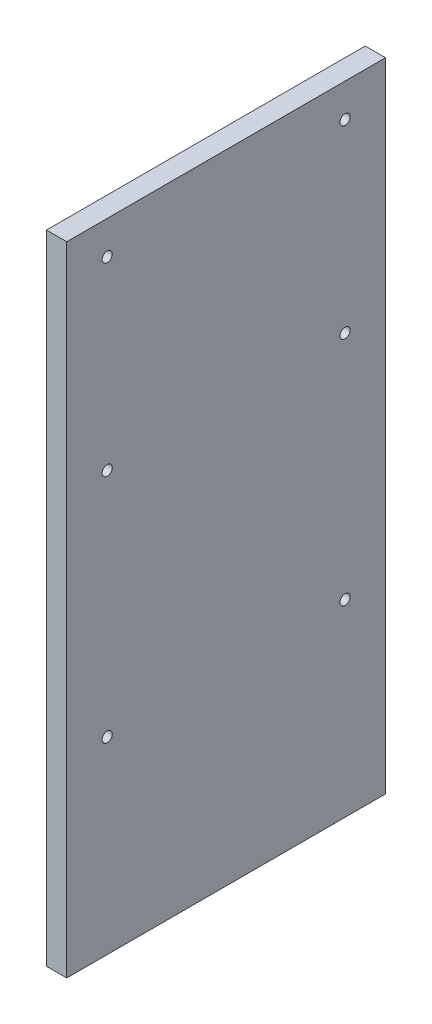
ISO-10303-21;
HEADER;
FILE_DESCRIPTION(('STEP AP214'),'2;1');
FILE_NAME('part.step','',(''),(''),'','','');
FILE_SCHEMA(('AUTOMOTIVE_DESIGN { 1 0 10303 214 1 1 1 1 }'));
ENDSEC;
DATA;
#1=APPLICATION_CONTEXT('core data for automotive mechanical design processes');
#2=APPLICATION_PROTOCOL_DEFINITION('international standard','automotive_design',2000,#1);
#3=PRODUCT_CONTEXT('',#1,'mechanical');
#4=PRODUCT('Part','Part','',(#3));
#5=PRODUCT_RELATED_PRODUCT_CATEGORY('part','',(#4));
#6=PRODUCT_DEFINITION_FORMATION('','',#4);
#7=PRODUCT_DEFINITION_CONTEXT('part definition',#1,'design');
#8=PRODUCT_DEFINITION('design','',#6,#7);
#9=PRODUCT_DEFINITION_SHAPE('','',#8);
#10=(LENGTH_UNIT() NAMED_UNIT(*) SI_UNIT(.MILLI.,.METRE.));
#11=(NAMED_UNIT(*) PLANE_ANGLE_UNIT() SI_UNIT($,.RADIAN.));
#12=(NAMED_UNIT(*) SI_UNIT($,.STERADIAN.) SOLID_ANGLE_UNIT());
#13=UNCERTAINTY_MEASURE_WITH_UNIT(LENGTH_MEASURE(1.E-05),#10,'distance_accuracy_value','');
#14=(GEOMETRIC_REPRESENTATION_CONTEXT(3) GLOBAL_UNCERTAINTY_ASSIGNED_CONTEXT((#13)) GLOBAL_UNIT_ASSIGNED_CONTEXT((#10,
#11,#12)) REPRESENTATION_CONTEXT('',''));
#15=CARTESIAN_POINT('',(0.,0.,0.));
#16=DIRECTION('',(0.,0.,1.));
#17=DIRECTION('',(1.,0.,0.));
#18=AXIS2_PLACEMENT_3D('',#15,#16,#17);
#19=CARTESIAN_POINT('',(6.35,0.,0.));
#20=DIRECTION('',(0.,0.,-1.));
#21=DIRECTION('',(0.,1.,0.));
#22=AXIS2_PLACEMENT_3D('',#19,#20,#21);
#23=PLANE('',#22);
#24=DIRECTION('',(0.,-1.,0.));
#25=VECTOR('',#24,1.);
#26=CARTESIAN_POINT('',(0.,0.,0.));
#27=LINE('',#26,#25);
#28=CARTESIAN_POINT('',(0.,0.,0.));
#29=VERTEX_POINT('',#28);
#30=CARTESIAN_POINT('',(0.,-200.,0.));
#31=VERTEX_POINT('',#30);
#32=EDGE_CURVE('E100',#29,#31,#27,.T.);
#33=ORIENTED_EDGE('',*,*,#32,.T.);
#34=DIRECTION('',(-1.,0.,0.));
#35=VECTOR('',#34,1.);
#36=CARTESIAN_POINT('',(6.35,-200.,0.));
#37=LINE('',#36,#35);
#38=CARTESIAN_POINT('',(6.35,-200.,0.));
#39=VERTEX_POINT('',#38);
#40=EDGE_CURVE('E11',#39,#31,#37,.T.);
#41=ORIENTED_EDGE('',*,*,#40,.F.);
#42=DIRECTION('',(0.,-1.,0.));
#43=VECTOR('',#42,1.);
#44=CARTESIAN_POINT('',(6.35,0.,0.));
#45=LINE('',#44,#43);
#46=CARTESIAN_POINT('',(6.35,0.,0.));
#47=VERTEX_POINT('',#46);
#48=EDGE_CURVE('E87',#47,#39,#45,.T.);
#49=ORIENTED_EDGE('',*,*,#48,.F.);
#50=DIRECTION('',(-1.,0.,0.));
#51=VECTOR('',#50,1.);
#52=CARTESIAN_POINT('',(6.35,0.,0.));
#53=LINE('',#52,#51);
#54=EDGE_CURVE('E96',#47,#29,#53,.T.);
#55=ORIENTED_EDGE('',*,*,#54,.T.);
#56=EDGE_LOOP('',(#33,#41,#49,#55));
#57=FACE_BOUND('',#56,.T.);
#58=ADVANCED_FACE('F34',(#57),#23,.F.);
#59=CARTESIAN_POINT('',(6.35,-200.,0.));
#60=DIRECTION('',(0.,1.,0.));
#61=DIRECTION('',(0.,0.,1.));
#62=AXIS2_PLACEMENT_3D('',#59,#60,#61);
#63=PLANE('',#62);
#64=DIRECTION('',(0.,0.,-1.));
#65=VECTOR('',#64,1.);
#66=CARTESIAN_POINT('',(0.,-200.,0.));
#67=LINE('',#66,#65);
#68=CARTESIAN_POINT('',(0.,-200.,-100.));
#69=VERTEX_POINT('',#68);
#70=EDGE_CURVE('E91',#31,#69,#67,.T.);
#71=ORIENTED_EDGE('',*,*,#70,.T.);
#72=DIRECTION('',(-1.,0.,0.));
#73=VECTOR('',#72,1.);
#74=CARTESIAN_POINT('',(6.35,-200.,-100.));
#75=LINE('',#74,#73);
#76=CARTESIAN_POINT('',(6.35,-200.,-100.));
#77=VERTEX_POINT('',#76);
#78=EDGE_CURVE('E43',#77,#69,#75,.T.);
#79=ORIENTED_EDGE('',*,*,#78,.F.);
#80=DIRECTION('',(0.,0.,-1.));
#81=VECTOR('',#80,1.);
#82=CARTESIAN_POINT('',(6.35,-200.,0.));
#83=LINE('',#82,#81);
#84=EDGE_CURVE('E82',#39,#77,#83,.T.);
#85=ORIENTED_EDGE('',*,*,#84,.F.);
#86=ORIENTED_EDGE('',*,*,#40,.T.);
#87=EDGE_LOOP('',(#71,#79,#85,#86));
#88=FACE_BOUND('',#87,.T.);
#89=ADVANCED_FACE('F90',(#88),#63,.F.);
#90=CARTESIAN_POINT('',(6.35,0.,-100.));
#91=DIRECTION('',(0.,0.,1.));
#92=DIRECTION('',(0.,-1.,0.));
#93=AXIS2_PLACEMENT_3D('',#90,#91,#92);
#94=PLANE('',#93);
#95=DIRECTION('',(0.,1.,0.));
#96=VECTOR('',#95,1.);
#97=CARTESIAN_POINT('',(0.,0.,-100.));
#98=LINE('',#97,#96);
#99=CARTESIAN_POINT('',(0.,0.,-100.));
#100=VERTEX_POINT('',#99);
#101=EDGE_CURVE('E69',#69,#100,#98,.T.);
#102=ORIENTED_EDGE('',*,*,#101,.T.);
#103=DIRECTION('',(-1.,0.,0.));
#104=VECTOR('',#103,1.);
#105=CARTESIAN_POINT('',(6.35,0.,-100.));
#106=LINE('',#105,#104);
#107=CARTESIAN_POINT('',(6.35,0.,-100.));
#108=VERTEX_POINT('',#107);
#109=EDGE_CURVE('E92',#108,#100,#106,.T.);
#110=ORIENTED_EDGE('',*,*,#109,.F.);
#111=DIRECTION('',(0.,1.,0.));
#112=VECTOR('',#111,1.);
#113=CARTESIAN_POINT('',(6.35,0.,-100.));
#114=LINE('',#113,#112);
#115=EDGE_CURVE('E85',#77,#108,#114,.T.);
#116=ORIENTED_EDGE('',*,*,#115,.F.);
#117=ORIENTED_EDGE('',*,*,#78,.T.);
#118=EDGE_LOOP('',(#102,#110,#116,#117));
#119=FACE_BOUND('',#118,.T.);
#120=ADVANCED_FACE('F94',(#119),#94,.F.);
#121=CARTESIAN_POINT('',(6.35,0.,0.));
#122=DIRECTION('',(0.,-1.,0.));
#123=DIRECTION('',(0.,0.,-1.));
#124=AXIS2_PLACEMENT_3D('',#121,#122,#123);
#125=PLANE('',#124);
#126=DIRECTION('',(0.,0.,1.));
#127=VECTOR('',#126,1.);
#128=CARTESIAN_POINT('',(0.,0.,0.));
#129=LINE('',#128,#127);
#130=EDGE_CURVE('E75',#100,#29,#129,.T.);
#131=ORIENTED_EDGE('',*,*,#130,.T.);
#132=ORIENTED_EDGE('',*,*,#54,.F.);
#133=DIRECTION('',(0.,0.,1.));
#134=VECTOR('',#133,1.);
#135=CARTESIAN_POINT('',(6.35,0.,0.));
#136=LINE('',#135,#134);
#137=EDGE_CURVE('E52',#108,#47,#136,.T.);
#138=ORIENTED_EDGE('',*,*,#137,.F.);
#139=ORIENTED_EDGE('',*,*,#109,.T.);
#140=EDGE_LOOP('',(#131,#132,#138,#139));
#141=FACE_BOUND('',#140,.T.);
#142=ADVANCED_FACE('F159',(#141),#125,.F.);
#143=CARTESIAN_POINT('',(6.35,0.,0.));
#144=DIRECTION('',(1.,0.,0.));
#145=DIRECTION('',(0.,0.,-1.));
#146=AXIS2_PLACEMENT_3D('',#143,#144,#145);
#147=PLANE('',#146);
#148=CARTESIAN_POINT('',(6.35,-140.84,-12.7));
#149=DIRECTION('',(1.,0.,0.));
#150=DIRECTION('',(0.,0.,-1.));
#151=AXIS2_PLACEMENT_3D('',#148,#149,#150);
#152=CIRCLE('',#151,1.5875);
#153=CARTESIAN_POINT('',(6.35,-140.84,-14.2875));
#154=VERTEX_POINT('',#153);
#155=EDGE_CURVE('E251',#154,#154,#152,.T.);
#156=ORIENTED_EDGE('',*,*,#155,.F.);
#157=EDGE_LOOP('',(#156));
#158=FACE_BOUND('',#157,.T.);
#159=CARTESIAN_POINT('',(6.35,-68.44,-87.3000000000001));
#160=DIRECTION('',(1.,0.,0.));
#161=DIRECTION('',(0.,0.,-1.));
#162=AXIS2_PLACEMENT_3D('',#159,#160,#161);
#163=CIRCLE('',#162,1.5875);
#164=CARTESIAN_POINT('',(6.35,-68.44,-88.8875000000001));
#165=VERTEX_POINT('',#164);
#166=EDGE_CURVE('E246',#165,#165,#163,.T.);
#167=ORIENTED_EDGE('',*,*,#166,.F.);
#168=EDGE_LOOP('',(#167));
#169=FACE_BOUND('',#168,.T.);
#170=CARTESIAN_POINT('',(6.35,-68.44,-12.7));
#171=DIRECTION('',(1.,0.,0.));
#172=DIRECTION('',(0.,0.,-1.));
#173=AXIS2_PLACEMENT_3D('',#170,#171,#172);
#174=CIRCLE('',#173,1.5875);
#175=CARTESIAN_POINT('',(6.35,-68.44,-14.2875));
#176=VERTEX_POINT('',#175);
#177=EDGE_CURVE('E232',#176,#176,#174,.T.);
#178=ORIENTED_EDGE('',*,*,#177,.F.);
#179=EDGE_LOOP('',(#178));
#180=FACE_BOUND('',#179,.T.);
#181=CARTESIAN_POINT('',(6.35,-10.44,-87.3));
#182=DIRECTION('',(1.,0.,0.));
#183=DIRECTION('',(0.,0.,-1.));
#184=AXIS2_PLACEMENT_3D('',#181,#182,#183);
#185=CIRCLE('',#184,1.5875);
#186=CARTESIAN_POINT('',(6.35,-10.44,-88.8875));
#187=VERTEX_POINT('',#186);
#188=EDGE_CURVE('E245',#187,#187,#185,.T.);
#189=ORIENTED_EDGE('',*,*,#188,.F.);
#190=EDGE_LOOP('',(#189));
#191=FACE_BOUND('',#190,.T.);
#192=CARTESIAN_POINT('',(6.35,-140.84,-87.3));
#193=DIRECTION('',(1.,0.,0.));
#194=DIRECTION('',(0.,0.,-1.));
#195=AXIS2_PLACEMENT_3D('',#192,#193,#194);
#196=CIRCLE('',#195,1.58749999999999);
#197=CARTESIAN_POINT('',(6.35,-140.84,-88.8875));
#198=VERTEX_POINT('',#197);
#199=EDGE_CURVE('E258',#198,#198,#196,.T.);
#200=ORIENTED_EDGE('',*,*,#199,.F.);
#201=EDGE_LOOP('',(#200));
#202=FACE_BOUND('',#201,.T.);
#203=CARTESIAN_POINT('',(6.35,-10.44,-12.7));
#204=DIRECTION('',(1.,0.,0.));
#205=DIRECTION('',(0.,0.,-1.));
#206=AXIS2_PLACEMENT_3D('',#203,#204,#205);
#207=CIRCLE('',#206,1.5875);
#208=CARTESIAN_POINT('',(6.35,-10.44,-14.2875));
#209=VERTEX_POINT('',#208);
#210=EDGE_CURVE('E112',#209,#209,#207,.T.);
#211=ORIENTED_EDGE('',*,*,#210,.F.);
#212=EDGE_LOOP('',(#211));
#213=FACE_BOUND('',#212,.T.);
#214=ORIENTED_EDGE('',*,*,#48,.T.);
#215=ORIENTED_EDGE('',*,*,#84,.T.);
#216=ORIENTED_EDGE('',*,*,#115,.T.);
#217=ORIENTED_EDGE('',*,*,#137,.T.);
#218=EDGE_LOOP('',(#214,#215,#216,#217));
#219=FACE_BOUND('',#218,.T.);
#220=ADVANCED_FACE('F83',(#158,#169,#180,#191,#202,#213,#219),#147,.T.);
#221=CARTESIAN_POINT('',(0.,0.,0.));
#222=DIRECTION('',(1.,0.,0.));
#223=DIRECTION('',(0.,0.,-1.));
#224=AXIS2_PLACEMENT_3D('',#221,#222,#223);
#225=PLANE('',#224);
#226=CARTESIAN_POINT('',(0.,-140.84,-12.7));
#227=DIRECTION('',(1.,0.,0.));
#228=DIRECTION('',(0.,0.,-1.));
#229=AXIS2_PLACEMENT_3D('',#226,#227,#228);
#230=CIRCLE('',#229,1.5875);
#231=CARTESIAN_POINT('',(0.,-140.84,-14.2875));
#232=VERTEX_POINT('',#231);
#233=EDGE_CURVE('E37',#232,#232,#230,.T.);
#234=ORIENTED_EDGE('',*,*,#233,.T.);
#235=EDGE_LOOP('',(#234));
#236=FACE_BOUND('',#235,.T.);
#237=CARTESIAN_POINT('',(0.,-68.44,-87.3000000000001));
#238=DIRECTION('',(1.,0.,0.));
#239=DIRECTION('',(0.,0.,-1.));
#240=AXIS2_PLACEMENT_3D('',#237,#238,#239);
#241=CIRCLE('',#240,1.5875);
#242=CARTESIAN_POINT('',(0.,-68.44,-88.8875000000001));
#243=VERTEX_POINT('',#242);
#244=EDGE_CURVE('E120',#243,#243,#241,.T.);
#245=ORIENTED_EDGE('',*,*,#244,.T.);
#246=EDGE_LOOP('',(#245));
#247=FACE_BOUND('',#246,.T.);
#248=CARTESIAN_POINT('',(0.,-68.44,-12.7));
#249=DIRECTION('',(1.,0.,0.));
#250=DIRECTION('',(0.,0.,-1.));
#251=AXIS2_PLACEMENT_3D('',#248,#249,#250);
#252=CIRCLE('',#251,1.5875);
#253=CARTESIAN_POINT('',(0.,-68.44,-14.2875));
#254=VERTEX_POINT('',#253);
#255=EDGE_CURVE('E118',#254,#254,#252,.T.);
#256=ORIENTED_EDGE('',*,*,#255,.T.);
#257=EDGE_LOOP('',(#256));
#258=FACE_BOUND('',#257,.T.);
#259=CARTESIAN_POINT('',(0.,-10.44,-87.3));
#260=DIRECTION('',(1.,0.,0.));
#261=DIRECTION('',(0.,0.,-1.));
#262=AXIS2_PLACEMENT_3D('',#259,#260,#261);
#263=CIRCLE('',#262,1.5875);
#264=CARTESIAN_POINT('',(0.,-10.44,-88.8875));
#265=VERTEX_POINT('',#264);
#266=EDGE_CURVE('E115',#265,#265,#263,.T.);
#267=ORIENTED_EDGE('',*,*,#266,.T.);
#268=EDGE_LOOP('',(#267));
#269=FACE_BOUND('',#268,.T.);
#270=CARTESIAN_POINT('',(0.,-140.84,-87.3));
#271=DIRECTION('',(1.,0.,0.));
#272=DIRECTION('',(0.,0.,-1.));
#273=AXIS2_PLACEMENT_3D('',#270,#271,#272);
#274=CIRCLE('',#273,1.58749999999999);
#275=CARTESIAN_POINT('',(0.,-140.84,-88.8875));
#276=VERTEX_POINT('',#275);
#277=EDGE_CURVE('E111',#276,#276,#274,.T.);
#278=ORIENTED_EDGE('',*,*,#277,.T.);
#279=EDGE_LOOP('',(#278));
#280=FACE_BOUND('',#279,.T.);
#281=CARTESIAN_POINT('',(0.,-10.44,-12.7));
#282=DIRECTION('',(1.,0.,0.));
#283=DIRECTION('',(0.,0.,-1.));
#284=AXIS2_PLACEMENT_3D('',#281,#282,#283);
#285=CIRCLE('',#284,1.5875);
#286=CARTESIAN_POINT('',(0.,-10.44,-14.2875));
#287=VERTEX_POINT('',#286);
#288=EDGE_CURVE('E108',#287,#287,#285,.T.);
#289=ORIENTED_EDGE('',*,*,#288,.T.);
#290=EDGE_LOOP('',(#289));
#291=FACE_BOUND('',#290,.T.);
#292=ORIENTED_EDGE('',*,*,#32,.F.);
#293=ORIENTED_EDGE('',*,*,#130,.F.);
#294=ORIENTED_EDGE('',*,*,#101,.F.);
#295=ORIENTED_EDGE('',*,*,#70,.F.);
#296=EDGE_LOOP('',(#292,#293,#294,#295));
#297=FACE_BOUND('',#296,.T.);
#298=ADVANCED_FACE('F127',(#236,#247,#258,#269,#280,#291,#297),#225,.F.);
#299=CARTESIAN_POINT('',(-3.65,-10.44,-12.7));
#300=DIRECTION('',(1.,0.,0.));
#301=DIRECTION('',(0.,0.,-1.));
#302=AXIS2_PLACEMENT_3D('',#299,#300,#301);
#303=CYLINDRICAL_SURFACE('',#302,1.5875);
#304=ORIENTED_EDGE('',*,*,#210,.T.);
#305=EDGE_LOOP('',(#304));
#306=FACE_BOUND('',#305,.T.);
#307=ORIENTED_EDGE('',*,*,#288,.F.);
#308=EDGE_LOOP('',(#307));
#309=FACE_BOUND('',#308,.T.);
#310=ADVANCED_FACE('F150',(#306,#309),#303,.F.);
#311=CARTESIAN_POINT('',(-3.65,-140.84,-87.3));
#312=DIRECTION('',(1.,0.,0.));
#313=DIRECTION('',(0.,0.,-1.));
#314=AXIS2_PLACEMENT_3D('',#311,#312,#313);
#315=CYLINDRICAL_SURFACE('',#314,1.58749999999999);
#316=ORIENTED_EDGE('',*,*,#199,.T.);
#317=EDGE_LOOP('',(#316));
#318=FACE_BOUND('',#317,.T.);
#319=ORIENTED_EDGE('',*,*,#277,.F.);
#320=EDGE_LOOP('',(#319));
#321=FACE_BOUND('',#320,.T.);
#322=ADVANCED_FACE('F156',(#318,#321),#315,.F.);
#323=CARTESIAN_POINT('',(-3.65,-10.44,-87.3));
#324=DIRECTION('',(1.,0.,0.));
#325=DIRECTION('',(0.,0.,-1.));
#326=AXIS2_PLACEMENT_3D('',#323,#324,#325);
#327=CYLINDRICAL_SURFACE('',#326,1.5875);
#328=ORIENTED_EDGE('',*,*,#188,.T.);
#329=EDGE_LOOP('',(#328));
#330=FACE_BOUND('',#329,.T.);
#331=ORIENTED_EDGE('',*,*,#266,.F.);
#332=EDGE_LOOP('',(#331));
#333=FACE_BOUND('',#332,.T.);
#334=ADVANCED_FACE('F197',(#330,#333),#327,.F.);
#335=CARTESIAN_POINT('',(-3.65,-68.44,-12.7));
#336=DIRECTION('',(1.,0.,0.));
#337=DIRECTION('',(0.,0.,-1.));
#338=AXIS2_PLACEMENT_3D('',#335,#336,#337);
#339=CYLINDRICAL_SURFACE('',#338,1.5875);
#340=ORIENTED_EDGE('',*,*,#177,.T.);
#341=EDGE_LOOP('',(#340));
#342=FACE_BOUND('',#341,.T.);
#343=ORIENTED_EDGE('',*,*,#255,.F.);
#344=EDGE_LOOP('',(#343));
#345=FACE_BOUND('',#344,.T.);
#346=ADVANCED_FACE('F137',(#342,#345),#339,.F.);
#347=CARTESIAN_POINT('',(-3.65,-68.44,-87.3000000000001));
#348=DIRECTION('',(1.,0.,0.));
#349=DIRECTION('',(0.,0.,-1.));
#350=AXIS2_PLACEMENT_3D('',#347,#348,#349);
#351=CYLINDRICAL_SURFACE('',#350,1.5875);
#352=ORIENTED_EDGE('',*,*,#166,.T.);
#353=EDGE_LOOP('',(#352));
#354=FACE_BOUND('',#353,.T.);
#355=ORIENTED_EDGE('',*,*,#244,.F.);
#356=EDGE_LOOP('',(#355));
#357=FACE_BOUND('',#356,.T.);
#358=ADVANCED_FACE('F131',(#354,#357),#351,.F.);
#359=CARTESIAN_POINT('',(-3.65,-140.84,-12.7));
#360=DIRECTION('',(1.,0.,0.));
#361=DIRECTION('',(0.,0.,-1.));
#362=AXIS2_PLACEMENT_3D('',#359,#360,#361);
#363=CYLINDRICAL_SURFACE('',#362,1.5875);
#364=ORIENTED_EDGE('',*,*,#155,.T.);
#365=EDGE_LOOP('',(#364));
#366=FACE_BOUND('',#365,.T.);
#367=ORIENTED_EDGE('',*,*,#233,.F.);
#368=EDGE_LOOP('',(#367));
#369=FACE_BOUND('',#368,.T.);
#370=ADVANCED_FACE('F129',(#366,#369),#363,.F.);
#371=CLOSED_SHELL('',(#58,#89,#120,#142,#220,#298,#310,#322,#334,#346,#358,#370));
#372=MANIFOLD_SOLID_BREP('B2',#371);
#373=ADVANCED_BREP_SHAPE_REPRESENTATION('',(#18,#372),#14);
#374=SHAPE_DEFINITION_REPRESENTATION(#9,#373);
ENDSEC;
END-ISO-10303-21;
